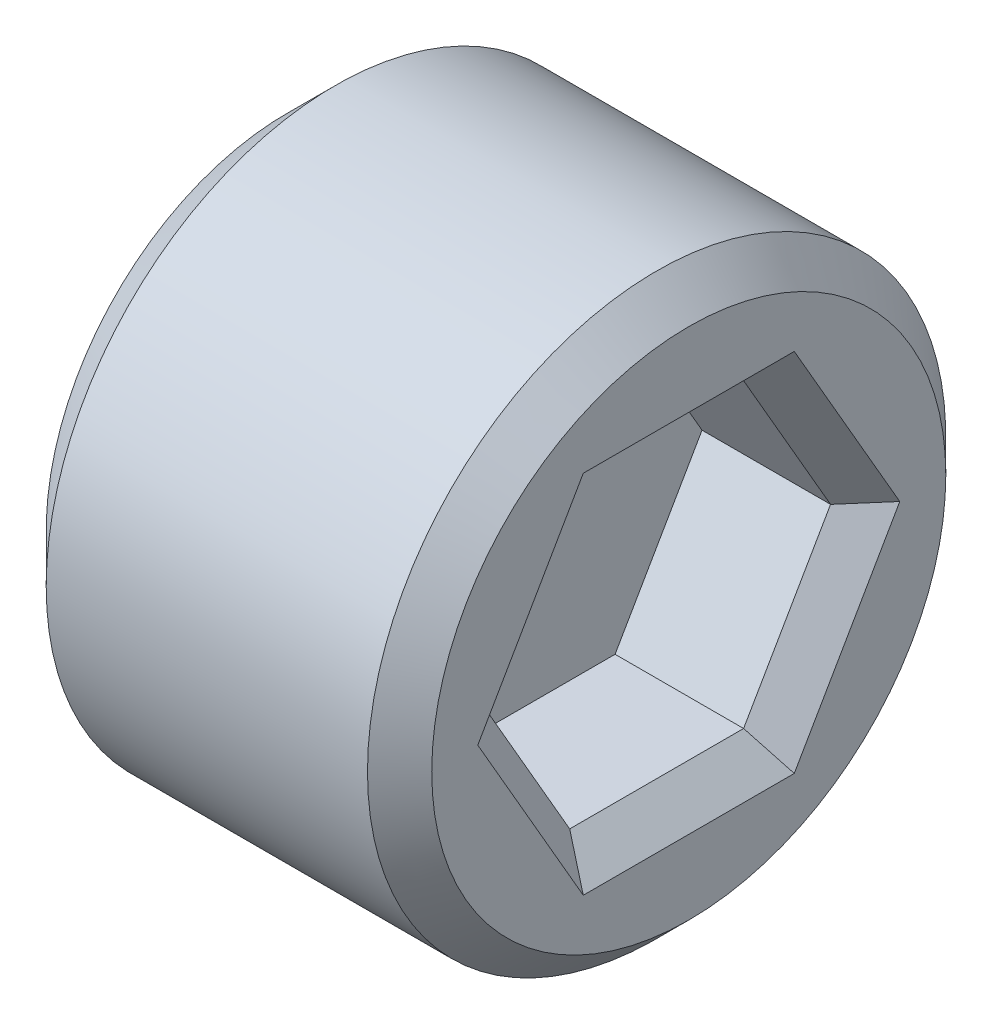
ISO-10303-21;
HEADER;
FILE_DESCRIPTION(('STEP AP214'),'2;1');
FILE_NAME('part.step','',(''),(''),'','','');
FILE_SCHEMA(('AUTOMOTIVE_DESIGN { 1 0 10303 214 1 1 1 1 }'));
ENDSEC;
DATA;
#1=APPLICATION_CONTEXT('core data for automotive mechanical design processes');
#2=APPLICATION_PROTOCOL_DEFINITION('international standard','automotive_design',2000,#1);
#3=PRODUCT_CONTEXT('',#1,'mechanical');
#4=PRODUCT('Part','Part','',(#3));
#5=PRODUCT_RELATED_PRODUCT_CATEGORY('part','',(#4));
#6=PRODUCT_DEFINITION_FORMATION('','',#4);
#7=PRODUCT_DEFINITION_CONTEXT('part definition',#1,'design');
#8=PRODUCT_DEFINITION('design','',#6,#7);
#9=PRODUCT_DEFINITION_SHAPE('','',#8);
#10=(LENGTH_UNIT() NAMED_UNIT(*) SI_UNIT(.MILLI.,.METRE.));
#11=(NAMED_UNIT(*) PLANE_ANGLE_UNIT() SI_UNIT($,.RADIAN.));
#12=(NAMED_UNIT(*) SI_UNIT($,.STERADIAN.) SOLID_ANGLE_UNIT());
#13=UNCERTAINTY_MEASURE_WITH_UNIT(LENGTH_MEASURE(1.E-05),#10,'distance_accuracy_value','');
#14=(GEOMETRIC_REPRESENTATION_CONTEXT(3) GLOBAL_UNCERTAINTY_ASSIGNED_CONTEXT((#13)) GLOBAL_UNIT_ASSIGNED_CONTEXT((#10,
#11,#12)) REPRESENTATION_CONTEXT('',''));
#15=CARTESIAN_POINT('',(0.,0.,0.));
#16=DIRECTION('',(0.,0.,1.));
#17=DIRECTION('',(1.,0.,0.));
#18=AXIS2_PLACEMENT_3D('',#15,#16,#17);
#19=CARTESIAN_POINT('',(4.572,3.58775,0.));
#20=DIRECTION('',(-1.,0.,0.));
#21=DIRECTION('',(0.,0.,1.));
#22=AXIS2_PLACEMENT_3D('',#19,#20,#21);
#23=PLANE('',#22);
#24=DIRECTION('',(0.,0.,1.));
#25=VECTOR('',#24,1.);
#26=CARTESIAN_POINT('',(4.572,2.397125,0.687407664253898));
#27=LINE('',#26,#25);
#28=CARTESIAN_POINT('',(4.572,2.397125,-0.687407664253898));
#29=VERTEX_POINT('',#28);
#30=CARTESIAN_POINT('',(4.572,2.397125,0.687407664253898));
#31=VERTEX_POINT('',#30);
#32=EDGE_CURVE('E91',#29,#31,#27,.T.);
#33=ORIENTED_EDGE('',*,*,#32,.F.);
#34=DIRECTION('',(0.,-0.866025403784439,0.5));
#35=VECTOR('',#34,1.);
#36=CARTESIAN_POINT('',(4.572,2.397125,-0.687407664253898));
#37=LINE('',#36,#35);
#38=CARTESIAN_POINT('',(4.572,3.58775,-1.3748153285078));
#39=VERTEX_POINT('',#38);
#40=EDGE_CURVE('E172',#39,#29,#37,.T.);
#41=ORIENTED_EDGE('',*,*,#40,.F.);
#42=DIRECTION('',(0.,-0.866025403784439,-0.5));
#43=VECTOR('',#42,1.);
#44=CARTESIAN_POINT('',(4.572,3.58775,-1.3748153285078));
#45=LINE('',#44,#43);
#46=CARTESIAN_POINT('',(4.572,4.778375,-0.687407664253898));
#47=VERTEX_POINT('',#46);
#48=EDGE_CURVE('E177',#47,#39,#45,.T.);
#49=ORIENTED_EDGE('',*,*,#48,.F.);
#50=DIRECTION('',(0.,0.,-1.));
#51=VECTOR('',#50,1.);
#52=CARTESIAN_POINT('',(4.572,4.778375,-0.687407664253898));
#53=LINE('',#52,#51);
#54=CARTESIAN_POINT('',(4.572,4.778375,0.687407664253898));
#55=VERTEX_POINT('',#54);
#56=EDGE_CURVE('E182',#55,#47,#53,.T.);
#57=ORIENTED_EDGE('',*,*,#56,.F.);
#58=DIRECTION('',(0.,0.866025403784439,-0.5));
#59=VECTOR('',#58,1.);
#60=CARTESIAN_POINT('',(4.572,4.778375,0.687407664253898));
#61=LINE('',#60,#59);
#62=CARTESIAN_POINT('',(4.572,3.58775,1.3748153285078));
#63=VERTEX_POINT('',#62);
#64=EDGE_CURVE('E102',#63,#55,#61,.T.);
#65=ORIENTED_EDGE('',*,*,#64,.F.);
#66=DIRECTION('',(0.,0.866025403784439,0.499999999999999));
#67=VECTOR('',#66,1.);
#68=CARTESIAN_POINT('',(4.572,3.58775,1.3748153285078));
#69=LINE('',#68,#67);
#70=EDGE_CURVE('E86',#31,#63,#69,.T.);
#71=ORIENTED_EDGE('',*,*,#70,.F.);
#72=EDGE_LOOP('',(#33,#41,#49,#57,#65,#71));
#73=FACE_BOUND('',#72,.T.);
#74=ADVANCED_FACE('F17',(#73),#23,.F.);
#75=CARTESIAN_POINT('',(5.842,2.397125,0.687407664253898));
#76=DIRECTION('',(0.,1.,0.));
#77=DIRECTION('',(0.,0.,1.));
#78=AXIS2_PLACEMENT_3D('',#75,#76,#77);
#79=PLANE('',#78);
#80=ORIENTED_EDGE('',*,*,#32,.T.);
#81=DIRECTION('',(1.,0.,0.));
#82=VECTOR('',#81,1.);
#83=CARTESIAN_POINT('',(5.842,2.397125,0.687407664253899));
#84=LINE('',#83,#82);
#85=CARTESIAN_POINT('',(5.588,2.397125,0.687407664253898));
#86=VERTEX_POINT('',#85);
#87=EDGE_CURVE('E93',#86,#31,#84,.F.);
#88=ORIENTED_EDGE('',*,*,#87,.F.);
#89=DIRECTION('',(0.,0.,1.));
#90=VECTOR('',#89,1.);
#91=CARTESIAN_POINT('',(5.588,2.397125,0.34370383212695));
#92=LINE('',#91,#90);
#93=CARTESIAN_POINT('',(5.588,2.397125,-0.687407664253898));
#94=VERTEX_POINT('',#93);
#95=EDGE_CURVE('E169',#94,#86,#92,.T.);
#96=ORIENTED_EDGE('',*,*,#95,.F.);
#97=DIRECTION('',(1.,0.,0.));
#98=VECTOR('',#97,1.);
#99=CARTESIAN_POINT('',(5.842,2.397125,-0.687407664253898));
#100=LINE('',#99,#98);
#101=EDGE_CURVE('E96',#29,#94,#100,.T.);
#102=ORIENTED_EDGE('',*,*,#101,.F.);
#103=EDGE_LOOP('',(#80,#88,#96,#102));
#104=FACE_BOUND('',#103,.T.);
#105=ADVANCED_FACE('F92',(#104),#79,.T.);
#106=CARTESIAN_POINT('',(5.842,3.58775,1.3748153285078));
#107=DIRECTION('',(0.,0.499999999999999,-0.866025403784439));
#108=DIRECTION('',(0.,0.866025403784439,0.499999999999999));
#109=AXIS2_PLACEMENT_3D('',#106,#107,#108);
#110=PLANE('',#109);
#111=ORIENTED_EDGE('',*,*,#70,.T.);
#112=DIRECTION('',(1.,0.,0.));
#113=VECTOR('',#112,1.);
#114=CARTESIAN_POINT('',(5.842,3.58775,1.3748153285078));
#115=LINE('',#114,#113);
#116=CARTESIAN_POINT('',(5.588,3.58775,1.3748153285078));
#117=VERTEX_POINT('',#116);
#118=EDGE_CURVE('E104',#117,#63,#115,.F.);
#119=ORIENTED_EDGE('',*,*,#118,.F.);
#120=DIRECTION('',(0.,0.866025403784439,0.5));
#121=VECTOR('',#120,1.);
#122=CARTESIAN_POINT('',(5.588,2.397125,0.687407664253898));
#123=LINE('',#122,#121);
#124=EDGE_CURVE('E109',#86,#117,#123,.T.);
#125=ORIENTED_EDGE('',*,*,#124,.F.);
#126=ORIENTED_EDGE('',*,*,#87,.T.);
#127=EDGE_LOOP('',(#111,#119,#125,#126));
#128=FACE_BOUND('',#127,.T.);
#129=ADVANCED_FACE('F107',(#128),#110,.T.);
#130=CARTESIAN_POINT('',(5.842,4.778375,0.687407664253898));
#131=DIRECTION('',(0.,-0.5,-0.866025403784439));
#132=DIRECTION('',(0.,0.866025403784439,-0.5));
#133=AXIS2_PLACEMENT_3D('',#130,#131,#132);
#134=PLANE('',#133);
#135=ORIENTED_EDGE('',*,*,#64,.T.);
#136=DIRECTION('',(1.,0.,0.));
#137=VECTOR('',#136,1.);
#138=CARTESIAN_POINT('',(5.842,4.778375,0.687407664253898));
#139=LINE('',#138,#137);
#140=CARTESIAN_POINT('',(5.588,4.778375,0.687407664253898));
#141=VERTEX_POINT('',#140);
#142=EDGE_CURVE('E184',#141,#55,#139,.F.);
#143=ORIENTED_EDGE('',*,*,#142,.F.);
#144=DIRECTION('',(0.,0.866025403784439,-0.5));
#145=VECTOR('',#144,1.);
#146=CARTESIAN_POINT('',(5.588,3.58775,1.3748153285078));
#147=LINE('',#146,#145);
#148=EDGE_CURVE('E160',#117,#141,#147,.T.);
#149=ORIENTED_EDGE('',*,*,#148,.F.);
#150=ORIENTED_EDGE('',*,*,#118,.T.);
#151=EDGE_LOOP('',(#135,#143,#149,#150));
#152=FACE_BOUND('',#151,.T.);
#153=ADVANCED_FACE('F189',(#152),#134,.T.);
#154=CARTESIAN_POINT('',(5.842,4.778375,-0.687407664253898));
#155=DIRECTION('',(0.,-1.,0.));
#156=DIRECTION('',(0.,0.,-1.));
#157=AXIS2_PLACEMENT_3D('',#154,#155,#156);
#158=PLANE('',#157);
#159=ORIENTED_EDGE('',*,*,#56,.T.);
#160=DIRECTION('',(1.,0.,0.));
#161=VECTOR('',#160,1.);
#162=CARTESIAN_POINT('',(5.842,4.778375,-0.687407664253898));
#163=LINE('',#162,#161);
#164=CARTESIAN_POINT('',(5.588,4.778375,-0.687407664253898));
#165=VERTEX_POINT('',#164);
#166=EDGE_CURVE('E179',#165,#47,#163,.F.);
#167=ORIENTED_EDGE('',*,*,#166,.F.);
#168=DIRECTION('',(0.,0.,1.));
#169=VECTOR('',#168,1.);
#170=CARTESIAN_POINT('',(5.588,4.778375,-0.34370383212695));
#171=LINE('',#170,#169);
#172=EDGE_CURVE('E154',#141,#165,#171,.F.);
#173=ORIENTED_EDGE('',*,*,#172,.F.);
#174=ORIENTED_EDGE('',*,*,#142,.T.);
#175=EDGE_LOOP('',(#159,#167,#173,#174));
#176=FACE_BOUND('',#175,.T.);
#177=ADVANCED_FACE('F206',(#176),#158,.T.);
#178=CARTESIAN_POINT('',(5.842,3.58775,-1.3748153285078));
#179=DIRECTION('',(0.,-0.5,0.866025403784439));
#180=DIRECTION('',(0.,-0.866025403784439,-0.5));
#181=AXIS2_PLACEMENT_3D('',#178,#179,#180);
#182=PLANE('',#181);
#183=ORIENTED_EDGE('',*,*,#48,.T.);
#184=DIRECTION('',(1.,0.,0.));
#185=VECTOR('',#184,1.);
#186=CARTESIAN_POINT('',(5.842,3.58775,-1.3748153285078));
#187=LINE('',#186,#185);
#188=CARTESIAN_POINT('',(5.588,3.58775,-1.3748153285078));
#189=VERTEX_POINT('',#188);
#190=EDGE_CURVE('E174',#189,#39,#187,.F.);
#191=ORIENTED_EDGE('',*,*,#190,.F.);
#192=DIRECTION('',(0.,-0.866025403784439,-0.5));
#193=VECTOR('',#192,1.);
#194=CARTESIAN_POINT('',(5.588,4.778375,-0.687407664253898));
#195=LINE('',#194,#193);
#196=EDGE_CURVE('E149',#165,#189,#195,.T.);
#197=ORIENTED_EDGE('',*,*,#196,.F.);
#198=ORIENTED_EDGE('',*,*,#166,.T.);
#199=EDGE_LOOP('',(#183,#191,#197,#198));
#200=FACE_BOUND('',#199,.T.);
#201=ADVANCED_FACE('F203',(#200),#182,.T.);
#202=CARTESIAN_POINT('',(5.842,2.397125,-0.687407664253898));
#203=DIRECTION('',(0.,0.5,0.866025403784439));
#204=DIRECTION('',(0.,-0.866025403784439,0.5));
#205=AXIS2_PLACEMENT_3D('',#202,#203,#204);
#206=PLANE('',#205);
#207=ORIENTED_EDGE('',*,*,#40,.T.);
#208=ORIENTED_EDGE('',*,*,#101,.T.);
#209=DIRECTION('',(0.,-0.866025403784439,0.5));
#210=VECTOR('',#209,1.);
#211=CARTESIAN_POINT('',(5.588,3.58775,-1.3748153285078));
#212=LINE('',#211,#210);
#213=EDGE_CURVE('E146',#189,#94,#212,.T.);
#214=ORIENTED_EDGE('',*,*,#213,.F.);
#215=ORIENTED_EDGE('',*,*,#190,.T.);
#216=EDGE_LOOP('',(#207,#208,#214,#215));
#217=FACE_BOUND('',#216,.T.);
#218=ADVANCED_FACE('F199',(#217),#206,.T.);
#219=CARTESIAN_POINT('',(5.715,2.270125,0.34370383212695));
#220=DIRECTION('',(0.707106781186549,0.707106781186546,0.));
#221=DIRECTION('',(-0.707106781186546,0.707106781186549,0.));
#222=AXIS2_PLACEMENT_3D('',#219,#220,#221);
#223=PLANE('',#222);
#224=DIRECTION('',(0.,0.,-1.));
#225=VECTOR('',#224,1.);
#226=CARTESIAN_POINT('',(5.842,2.143125,0.));
#227=LINE('',#226,#225);
#228=CARTESIAN_POINT('',(5.842,2.143125,-0.834054632628062));
#229=VERTEX_POINT('',#228);
#230=CARTESIAN_POINT('',(5.842,2.143125,0.834054632628064));
#231=VERTEX_POINT('',#230);
#232=EDGE_CURVE('E140',#229,#231,#227,.F.);
#233=ORIENTED_EDGE('',*,*,#232,.F.);
#234=DIRECTION('',(0.654653670707975,-0.65465367070798,-0.377964473009227));
#235=VECTOR('',#234,1.);
#236=CARTESIAN_POINT('',(5.588,2.397125,-0.687407664253897));
#237=LINE('',#236,#235);
#238=EDGE_CURVE('E143',#94,#229,#237,.T.);
#239=ORIENTED_EDGE('',*,*,#238,.F.);
#240=ORIENTED_EDGE('',*,*,#95,.T.);
#241=DIRECTION('',(-0.654653670707974,0.654653670707978,-0.377964473009232));
#242=VECTOR('',#241,1.);
#243=CARTESIAN_POINT('',(5.842,2.143125,0.834054632628065));
#244=LINE('',#243,#242);
#245=EDGE_CURVE('E167',#231,#86,#244,.T.);
#246=ORIENTED_EDGE('',*,*,#245,.F.);
#247=EDGE_LOOP('',(#233,#239,#240,#246));
#248=FACE_BOUND('',#247,.T.);
#249=ADVANCED_FACE('F195',(#248),#223,.T.);
#250=CARTESIAN_POINT('',(5.715,3.22659375,1.31294863872495));
#251=DIRECTION('',(0.70710678118655,0.353553390593272,-0.612372435695793));
#252=DIRECTION('',(-0.654653670707975,0.,-0.755928946018456));
#253=AXIS2_PLACEMENT_3D('',#250,#251,#252);
#254=PLANE('',#253);
#255=ORIENTED_EDGE('',*,*,#124,.T.);
#256=DIRECTION('',(-0.654653670707976,0.,-0.755928946018456));
#257=VECTOR('',#256,1.);
#258=CARTESIAN_POINT('',(5.44172321428571,3.58775,1.20590944529112));
#259=LINE('',#258,#257);
#260=CARTESIAN_POINT('',(5.842,3.58775,1.66810926525613));
#261=VERTEX_POINT('',#260);
#262=EDGE_CURVE('E163',#261,#117,#259,.T.);
#263=ORIENTED_EDGE('',*,*,#262,.F.);
#264=DIRECTION('',(0.,0.866025403784439,0.499999999999999));
#265=VECTOR('',#264,1.);
#266=CARTESIAN_POINT('',(5.842,2.143125,0.834054632628064));
#267=LINE('',#266,#265);
#268=EDGE_CURVE('E137',#231,#261,#267,.T.);
#269=ORIENTED_EDGE('',*,*,#268,.F.);
#270=ORIENTED_EDGE('',*,*,#245,.T.);
#271=EDGE_LOOP('',(#255,#263,#269,#270));
#272=FACE_BOUND('',#271,.T.);
#273=ADVANCED_FACE('F191',(#272),#254,.T.);
#274=CARTESIAN_POINT('',(5.715,4.54421875,0.969244806597996));
#275=DIRECTION('',(0.707106781186549,-0.353553390593273,-0.612372435695793));
#276=DIRECTION('',(-0.654653670707976,0.,-0.755928946018456));
#277=AXIS2_PLACEMENT_3D('',#274,#275,#276);
#278=PLANE('',#277);
#279=ORIENTED_EDGE('',*,*,#148,.T.);
#280=DIRECTION('',(-0.654653670707976,-0.654653670707976,-0.37796447300923));
#281=VECTOR('',#280,1.);
#282=CARTESIAN_POINT('',(5.842,5.032375,0.834054632628064));
#283=LINE('',#282,#281);
#284=CARTESIAN_POINT('',(5.842,5.032375,0.834054632628064));
#285=VERTEX_POINT('',#284);
#286=EDGE_CURVE('E157',#285,#141,#283,.T.);
#287=ORIENTED_EDGE('',*,*,#286,.F.);
#288=DIRECTION('',(0.,0.866025403784439,-0.499999999999999));
#289=VECTOR('',#288,1.);
#290=CARTESIAN_POINT('',(5.842,3.58775,1.66810926525613));
#291=LINE('',#290,#289);
#292=EDGE_CURVE('E134',#261,#285,#291,.T.);
#293=ORIENTED_EDGE('',*,*,#292,.F.);
#294=ORIENTED_EDGE('',*,*,#262,.T.);
#295=EDGE_LOOP('',(#279,#287,#293,#294));
#296=FACE_BOUND('',#295,.T.);
#297=ADVANCED_FACE('F211',(#296),#278,.T.);
#298=CARTESIAN_POINT('',(5.715,4.905375,-0.34370383212695));
#299=DIRECTION('',(0.707106781186549,-0.707106781186546,0.));
#300=DIRECTION('',(0.707106781186546,0.707106781186549,0.));
#301=AXIS2_PLACEMENT_3D('',#298,#299,#300);
#302=PLANE('',#301);
#303=ORIENTED_EDGE('',*,*,#172,.T.);
#304=DIRECTION('',(-0.654653670707977,-0.654653670707977,0.377964473009229));
#305=VECTOR('',#304,1.);
#306=CARTESIAN_POINT('',(5.842,5.032375,-0.834054632628064));
#307=LINE('',#306,#305);
#308=CARTESIAN_POINT('',(5.842,5.032375,-0.834054632628064));
#309=VERTEX_POINT('',#308);
#310=EDGE_CURVE('E151',#309,#165,#307,.T.);
#311=ORIENTED_EDGE('',*,*,#310,.F.);
#312=DIRECTION('',(0.,0.,-1.));
#313=VECTOR('',#312,1.);
#314=CARTESIAN_POINT('',(5.842,5.032375,0.));
#315=LINE('',#314,#313);
#316=EDGE_CURVE('E129',#285,#309,#315,.T.);
#317=ORIENTED_EDGE('',*,*,#316,.F.);
#318=ORIENTED_EDGE('',*,*,#286,.T.);
#319=EDGE_LOOP('',(#303,#311,#317,#318));
#320=FACE_BOUND('',#319,.T.);
#321=ADVANCED_FACE('F208',(#320),#302,.T.);
#322=CARTESIAN_POINT('',(5.715,3.94890625,-1.31294863872495));
#323=DIRECTION('',(0.707106781186549,-0.353553390593273,0.612372435695793));
#324=DIRECTION('',(0.654653670707976,0.,-0.755928946018456));
#325=AXIS2_PLACEMENT_3D('',#322,#323,#324);
#326=PLANE('',#325);
#327=ORIENTED_EDGE('',*,*,#196,.T.);
#328=DIRECTION('',(0.654653670707976,0.,-0.755928946018456));
#329=VECTOR('',#328,1.);
#330=CARTESIAN_POINT('',(5.44172321428571,3.58775,-1.20590944529112));
#331=LINE('',#330,#329);
#332=CARTESIAN_POINT('',(5.842,3.58775,-1.66810926525613));
#333=VERTEX_POINT('',#332);
#334=EDGE_CURVE('E35',#333,#189,#331,.F.);
#335=ORIENTED_EDGE('',*,*,#334,.F.);
#336=DIRECTION('',(0.,-0.866025403784439,-0.499999999999999));
#337=VECTOR('',#336,1.);
#338=CARTESIAN_POINT('',(5.842,5.032375,-0.834054632628064));
#339=LINE('',#338,#337);
#340=EDGE_CURVE('E124',#309,#333,#339,.T.);
#341=ORIENTED_EDGE('',*,*,#340,.F.);
#342=ORIENTED_EDGE('',*,*,#310,.T.);
#343=EDGE_LOOP('',(#327,#335,#341,#342));
#344=FACE_BOUND('',#343,.T.);
#345=ADVANCED_FACE('F271',(#344),#326,.T.);
#346=CARTESIAN_POINT('',(5.715,2.63128125,-0.969244806597996));
#347=DIRECTION('',(0.707106781186549,0.353553390593273,0.612372435695793));
#348=DIRECTION('',(0.654653670707976,0.,-0.755928946018456));
#349=AXIS2_PLACEMENT_3D('',#346,#347,#348);
#350=PLANE('',#349);
#351=DIRECTION('',(0.,-0.866025403784438,0.500000000000001));
#352=VECTOR('',#351,1.);
#353=CARTESIAN_POINT('',(5.842,3.58775,-1.66810926525613));
#354=LINE('',#353,#352);
#355=EDGE_CURVE('E120',#333,#229,#354,.T.);
#356=ORIENTED_EDGE('',*,*,#355,.F.);
#357=ORIENTED_EDGE('',*,*,#334,.T.);
#358=ORIENTED_EDGE('',*,*,#213,.T.);
#359=ORIENTED_EDGE('',*,*,#238,.T.);
#360=EDGE_LOOP('',(#356,#357,#358,#359));
#361=FACE_BOUND('',#360,.T.);
#362=ADVANCED_FACE('F226',(#361),#350,.T.);
#363=CARTESIAN_POINT('',(2.667,3.58775,0.));
#364=DIRECTION('',(-1.,0.,0.));
#365=DIRECTION('',(0.,0.,1.));
#366=AXIS2_PLACEMENT_3D('',#363,#364,#365);
#367=PLANE('',#366);
#368=CARTESIAN_POINT('',(2.666999999974,3.58775,0.));
#369=DIRECTION('',(1.,0.,0.));
#370=DIRECTION('',(0.,0.,-1.));
#371=AXIS2_PLACEMENT_3D('',#368,#369,#370);
#372=CIRCLE('',#371,1.90499999996518);
#373=CARTESIAN_POINT('',(2.666999999974,3.58775,-1.90499999996518));
#374=VERTEX_POINT('',#373);
#375=EDGE_CURVE('E20',#374,#374,#372,.T.);
#376=ORIENTED_EDGE('',*,*,#375,.F.);
#377=EDGE_LOOP('',(#376));
#378=FACE_BOUND('',#377,.T.);
#379=ADVANCED_FACE('F216',(#378),#367,.T.);
#380=CARTESIAN_POINT('',(5.842,3.58775,0.));
#381=DIRECTION('',(1.,0.,0.));
#382=DIRECTION('',(0.,0.,-1.));
#383=AXIS2_PLACEMENT_3D('',#380,#381,#382);
#384=PLANE('',#383);
#385=ORIENTED_EDGE('',*,*,#340,.T.);
#386=ORIENTED_EDGE('',*,*,#355,.T.);
#387=ORIENTED_EDGE('',*,*,#232,.T.);
#388=ORIENTED_EDGE('',*,*,#268,.T.);
#389=ORIENTED_EDGE('',*,*,#292,.T.);
#390=ORIENTED_EDGE('',*,*,#316,.T.);
#391=EDGE_LOOP('',(#385,#386,#387,#388,#389,#390));
#392=FACE_BOUND('',#391,.T.);
#393=CARTESIAN_POINT('',(5.84199999997281,3.58775,0.));
#394=DIRECTION('',(-1.,0.,0.));
#395=DIRECTION('',(0.,0.,1.));
#396=AXIS2_PLACEMENT_3D('',#393,#394,#395);
#397=CIRCLE('',#396,2.03200000004244);
#398=CARTESIAN_POINT('',(5.84199999997281,3.58775,2.03200000004244));
#399=VERTEX_POINT('',#398);
#400=EDGE_CURVE('E113',#399,#399,#397,.T.);
#401=ORIENTED_EDGE('',*,*,#400,.F.);
#402=EDGE_LOOP('',(#401));
#403=FACE_BOUND('',#402,.T.);
#404=ADVANCED_FACE('F212',(#392,#403),#384,.T.);
#405=CARTESIAN_POINT('',(3.0479999999784,3.58775,0.));
#406=DIRECTION('',(1.,0.,0.));
#407=DIRECTION('',(0.,0.,-1.));
#408=AXIS2_PLACEMENT_3D('',#405,#406,#407);
#409=CONICAL_SURFACE('',#408,2.28599999996959,0.785398163397448);
#410=CARTESIAN_POINT('',(3.048,3.58775,0.));
#411=DIRECTION('',(-1.,0.,0.));
#412=DIRECTION('',(0.,0.,1.));
#413=AXIS2_PLACEMENT_3D('',#410,#411,#412);
#414=CIRCLE('',#413,2.286);
#415=CARTESIAN_POINT('',(3.048,3.58775,2.286));
#416=VERTEX_POINT('',#415);
#417=EDGE_CURVE('E26',#416,#416,#414,.F.);
#418=ORIENTED_EDGE('',*,*,#417,.F.);
#419=EDGE_LOOP('',(#418));
#420=FACE_BOUND('',#419,.T.);
#421=ORIENTED_EDGE('',*,*,#375,.T.);
#422=EDGE_LOOP('',(#421));
#423=FACE_BOUND('',#422,.T.);
#424=ADVANCED_FACE('F215',(#420,#423),#409,.T.);
#425=CARTESIAN_POINT('',(5.58799999998882,3.58775,0.));
#426=DIRECTION('',(-1.,0.,0.));
#427=DIRECTION('',(0.,0.,1.));
#428=AXIS2_PLACEMENT_3D('',#425,#426,#427);
#429=CONICAL_SURFACE('',#428,2.28600000002643,0.785398163397448);
#430=CARTESIAN_POINT('',(5.588,3.58775,0.));
#431=DIRECTION('',(-1.,0.,0.));
#432=DIRECTION('',(0.,0.,1.));
#433=AXIS2_PLACEMENT_3D('',#430,#431,#432);
#434=CIRCLE('',#433,2.286);
#435=CARTESIAN_POINT('',(5.588,3.58775,2.286));
#436=VERTEX_POINT('',#435);
#437=EDGE_CURVE('E11',#436,#436,#434,.T.);
#438=ORIENTED_EDGE('',*,*,#437,.F.);
#439=EDGE_LOOP('',(#438));
#440=FACE_BOUND('',#439,.T.);
#441=ORIENTED_EDGE('',*,*,#400,.T.);
#442=EDGE_LOOP('',(#441));
#443=FACE_BOUND('',#442,.T.);
#444=ADVANCED_FACE('F223',(#440,#443),#429,.T.);
#445=CARTESIAN_POINT('',(5.842,3.58775,0.));
#446=DIRECTION('',(-1.,0.,0.));
#447=DIRECTION('',(0.,0.,1.));
#448=AXIS2_PLACEMENT_3D('',#445,#446,#447);
#449=CYLINDRICAL_SURFACE('',#448,2.286);
#450=ORIENTED_EDGE('',*,*,#437,.T.);
#451=EDGE_LOOP('',(#450));
#452=FACE_BOUND('',#451,.T.);
#453=ORIENTED_EDGE('',*,*,#417,.T.);
#454=EDGE_LOOP('',(#453));
#455=FACE_BOUND('',#454,.T.);
#456=ADVANCED_FACE('F229',(#452,#455),#449,.T.);
#457=CLOSED_SHELL('',(#74,#105,#129,#153,#177,#201,#218,#249,#273,#297,#321,#345,#362,#379,#404,
#424,#444,#456));
#458=MANIFOLD_SOLID_BREP('B1',#457);
#459=ADVANCED_BREP_SHAPE_REPRESENTATION('',(#18,#458),#14);
#460=SHAPE_DEFINITION_REPRESENTATION(#9,#459);
ENDSEC;
END-ISO-10303-21;
